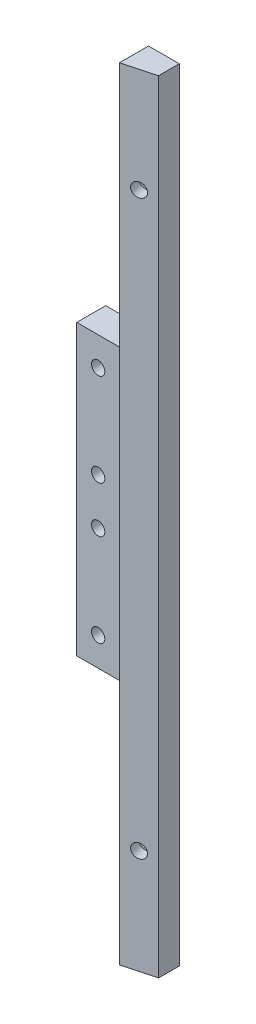
ISO-10303-21;
HEADER;
FILE_DESCRIPTION(('STEP AP214'),'2;1');
FILE_NAME('part.step','',(''),(''),'','','');
FILE_SCHEMA(('AUTOMOTIVE_DESIGN { 1 0 10303 214 1 1 1 1 }'));
ENDSEC;
DATA;
#1=APPLICATION_CONTEXT('core data for automotive mechanical design processes');
#2=APPLICATION_PROTOCOL_DEFINITION('international standard','automotive_design',2000,#1);
#3=PRODUCT_CONTEXT('',#1,'mechanical');
#4=PRODUCT('Part','Part','',(#3));
#5=PRODUCT_RELATED_PRODUCT_CATEGORY('part','',(#4));
#6=PRODUCT_DEFINITION_FORMATION('','',#4);
#7=PRODUCT_DEFINITION_CONTEXT('part definition',#1,'design');
#8=PRODUCT_DEFINITION('design','',#6,#7);
#9=PRODUCT_DEFINITION_SHAPE('','',#8);
#10=(LENGTH_UNIT() NAMED_UNIT(*) SI_UNIT(.MILLI.,.METRE.));
#11=(NAMED_UNIT(*) PLANE_ANGLE_UNIT() SI_UNIT($,.RADIAN.));
#12=(NAMED_UNIT(*) SI_UNIT($,.STERADIAN.) SOLID_ANGLE_UNIT());
#13=UNCERTAINTY_MEASURE_WITH_UNIT(LENGTH_MEASURE(1.E-05),#10,'distance_accuracy_value','');
#14=(GEOMETRIC_REPRESENTATION_CONTEXT(3) GLOBAL_UNCERTAINTY_ASSIGNED_CONTEXT((#13)) GLOBAL_UNIT_ASSIGNED_CONTEXT((#10,
#11,#12)) REPRESENTATION_CONTEXT('',''));
#15=CARTESIAN_POINT('',(0.,0.,0.));
#16=DIRECTION('',(0.,0.,1.));
#17=DIRECTION('',(1.,0.,0.));
#18=AXIS2_PLACEMENT_3D('',#15,#16,#17);
#19=CARTESIAN_POINT('',(-106.280981945714,-359.761258467887,110.891426791378));
#20=DIRECTION('',(0.,0.,-1.));
#21=DIRECTION('',(-1.,0.,0.));
#22=AXIS2_PLACEMENT_3D('',#19,#20,#21);
#23=CYLINDRICAL_SURFACE('',#22,2.30000000000001);
#24=CARTESIAN_POINT('',(-106.280981945714,-359.761258467887,0.));
#25=DIRECTION('',(0.,0.,1.));
#26=DIRECTION('',(1.,0.,0.));
#27=AXIS2_PLACEMENT_3D('',#24,#25,#26);
#28=CIRCLE('',#27,2.30000000000001);
#29=CARTESIAN_POINT('',(-103.980981945714,-359.761258467887,0.));
#30=VERTEX_POINT('',#29);
#31=EDGE_CURVE('E191',#30,#30,#28,.T.);
#32=ORIENTED_EDGE('',*,*,#31,.F.);
#33=EDGE_LOOP('',(#32));
#34=FACE_BOUND('',#33,.T.);
#35=CARTESIAN_POINT('',(-106.280981945714,-359.761258467887,10.0000000000001));
#36=DIRECTION('',(0.,0.,1.));
#37=DIRECTION('',(0.,-1.,0.));
#38=AXIS2_PLACEMENT_3D('',#35,#36,#37);
#39=CIRCLE('',#38,2.30000000000001);
#40=CARTESIAN_POINT('',(-106.280981945714,-362.061258467887,10.0000000000001));
#41=VERTEX_POINT('',#40);
#42=EDGE_CURVE('E163',#41,#41,#39,.T.);
#43=ORIENTED_EDGE('',*,*,#42,.T.);
#44=EDGE_LOOP('',(#43));
#45=FACE_BOUND('',#44,.T.);
#46=ADVANCED_FACE('F39',(#34,#45),#23,.F.);
#47=CARTESIAN_POINT('',(-113.680981945714,-401.661258467887,110.891426791378));
#48=DIRECTION('',(0.,1.,0.));
#49=DIRECTION('',(0.,0.,1.));
#50=AXIS2_PLACEMENT_3D('',#47,#48,#49);
#51=PLANE('',#50);
#52=DIRECTION('',(1.,0.,0.));
#53=VECTOR('',#52,1.);
#54=CARTESIAN_POINT('',(-113.680981945714,-401.661258467887,10.0000000000002));
#55=LINE('',#54,#53);
#56=CARTESIAN_POINT('',(-113.680981945714,-401.661258467887,10.0000000000002));
#57=VERTEX_POINT('',#56);
#58=CARTESIAN_POINT('',(-98.880981945714,-401.661258467887,10.0000000000001));
#59=VERTEX_POINT('',#58);
#60=EDGE_CURVE('E63',#57,#59,#55,.T.);
#61=ORIENTED_EDGE('',*,*,#60,.F.);
#62=DIRECTION('',(0.,0.,-1.));
#63=VECTOR('',#62,1.);
#64=CARTESIAN_POINT('',(-113.680981945714,-401.661258467887,110.891426791378));
#65=LINE('',#64,#63);
#66=CARTESIAN_POINT('',(-113.680981945714,-401.661258467887,0.));
#67=VERTEX_POINT('',#66);
#68=EDGE_CURVE('E49',#57,#67,#65,.T.);
#69=ORIENTED_EDGE('',*,*,#68,.T.);
#70=DIRECTION('',(1.,0.,0.));
#71=VECTOR('',#70,1.);
#72=CARTESIAN_POINT('',(-113.680981945714,-401.661258467887,0.));
#73=LINE('',#72,#71);
#74=CARTESIAN_POINT('',(-98.880981945714,-401.661258467887,0.));
#75=VERTEX_POINT('',#74);
#76=EDGE_CURVE('E205',#67,#75,#73,.T.);
#77=ORIENTED_EDGE('',*,*,#76,.T.);
#78=DIRECTION('',(0.,0.,-1.));
#79=VECTOR('',#78,1.);
#80=CARTESIAN_POINT('',(-98.880981945714,-401.661258467887,110.891426791378));
#81=LINE('',#80,#79);
#82=EDGE_CURVE('E212',#59,#75,#81,.T.);
#83=ORIENTED_EDGE('',*,*,#82,.F.);
#84=EDGE_LOOP('',(#61,#69,#77,#83));
#85=FACE_BOUND('',#84,.T.);
#86=ADVANCED_FACE('F216',(#85),#51,.F.);
#87=CARTESIAN_POINT('',(-113.680981945714,-301.861258467887,110.891426791378));
#88=DIRECTION('',(1.,0.,0.));
#89=DIRECTION('',(0.,0.,-1.));
#90=AXIS2_PLACEMENT_3D('',#87,#88,#89);
#91=PLANE('',#90);
#92=DIRECTION('',(0.,-1.,0.));
#93=VECTOR('',#92,1.);
#94=CARTESIAN_POINT('',(-113.680981945714,-301.861258467887,10.0000000000001));
#95=LINE('',#94,#93);
#96=CARTESIAN_POINT('',(-113.680981945714,-301.861258467887,10.0000000000001));
#97=VERTEX_POINT('',#96);
#98=EDGE_CURVE('E55',#97,#57,#95,.T.);
#99=ORIENTED_EDGE('',*,*,#98,.F.);
#100=DIRECTION('',(0.,0.,-1.));
#101=VECTOR('',#100,1.);
#102=CARTESIAN_POINT('',(-113.680981945714,-301.861258467887,110.891426791378));
#103=LINE('',#102,#101);
#104=CARTESIAN_POINT('',(-113.680981945714,-301.861258467887,0.));
#105=VERTEX_POINT('',#104);
#106=EDGE_CURVE('E11',#97,#105,#103,.T.);
#107=ORIENTED_EDGE('',*,*,#106,.T.);
#108=DIRECTION('',(0.,-1.,0.));
#109=VECTOR('',#108,1.);
#110=CARTESIAN_POINT('',(-113.680981945714,-301.861258467887,0.));
#111=LINE('',#110,#109);
#112=EDGE_CURVE('E201',#105,#67,#111,.T.);
#113=ORIENTED_EDGE('',*,*,#112,.T.);
#114=ORIENTED_EDGE('',*,*,#68,.F.);
#115=EDGE_LOOP('',(#99,#107,#113,#114));
#116=FACE_BOUND('',#115,.T.);
#117=ADVANCED_FACE('F218',(#116),#91,.F.);
#118=CARTESIAN_POINT('',(-113.680981945714,-301.861258467887,110.891426791378));
#119=DIRECTION('',(0.,-1.,0.));
#120=DIRECTION('',(0.,0.,-1.));
#121=AXIS2_PLACEMENT_3D('',#118,#119,#120);
#122=PLANE('',#121);
#123=DIRECTION('',(-1.,0.,0.));
#124=VECTOR('',#123,1.);
#125=CARTESIAN_POINT('',(-113.680981945714,-301.861258467887,10.0000000000001));
#126=LINE('',#125,#124);
#127=CARTESIAN_POINT('',(-98.880981945714,-301.861258467887,10.0000000000001));
#128=VERTEX_POINT('',#127);
#129=EDGE_CURVE('E179',#128,#97,#126,.T.);
#130=ORIENTED_EDGE('',*,*,#129,.F.);
#131=DIRECTION('',(0.,0.,-1.));
#132=VECTOR('',#131,1.);
#133=CARTESIAN_POINT('',(-98.880981945714,-301.861258467887,110.891426791378));
#134=LINE('',#133,#132);
#135=CARTESIAN_POINT('',(-98.880981945714,-301.861258467887,0.));
#136=VERTEX_POINT('',#135);
#137=EDGE_CURVE('E209',#128,#136,#134,.T.);
#138=ORIENTED_EDGE('',*,*,#137,.T.);
#139=DIRECTION('',(-1.,0.,0.));
#140=VECTOR('',#139,1.);
#141=CARTESIAN_POINT('',(-113.680981945714,-301.861258467887,0.));
#142=LINE('',#141,#140);
#143=EDGE_CURVE('E114',#136,#105,#142,.T.);
#144=ORIENTED_EDGE('',*,*,#143,.T.);
#145=ORIENTED_EDGE('',*,*,#106,.F.);
#146=EDGE_LOOP('',(#130,#138,#144,#145));
#147=FACE_BOUND('',#146,.T.);
#148=ADVANCED_FACE('F41',(#147),#122,.F.);
#149=CARTESIAN_POINT('',(-106.280981945714,-391.761258467887,110.891426791378));
#150=DIRECTION('',(0.,0.,-1.));
#151=DIRECTION('',(-1.,0.,0.));
#152=AXIS2_PLACEMENT_3D('',#149,#150,#151);
#153=CYLINDRICAL_SURFACE('',#152,2.30000000000001);
#154=CARTESIAN_POINT('',(-106.280981945714,-391.761258467887,0.));
#155=DIRECTION('',(0.,0.,1.));
#156=DIRECTION('',(1.,0.,0.));
#157=AXIS2_PLACEMENT_3D('',#154,#155,#156);
#158=CIRCLE('',#157,2.30000000000001);
#159=CARTESIAN_POINT('',(-103.980981945714,-391.761258467887,0.));
#160=VERTEX_POINT('',#159);
#161=EDGE_CURVE('E195',#160,#160,#158,.T.);
#162=ORIENTED_EDGE('',*,*,#161,.F.);
#163=EDGE_LOOP('',(#162));
#164=FACE_BOUND('',#163,.T.);
#165=CARTESIAN_POINT('',(-106.280981945714,-391.761258467887,10.0000000000002));
#166=DIRECTION('',(0.,0.,1.));
#167=DIRECTION('',(0.,-1.,0.));
#168=AXIS2_PLACEMENT_3D('',#165,#166,#167);
#169=CIRCLE('',#168,2.30000000000001);
#170=CARTESIAN_POINT('',(-106.280981945714,-394.061258467887,10.0000000000002));
#171=VERTEX_POINT('',#170);
#172=EDGE_CURVE('E167',#171,#171,#169,.T.);
#173=ORIENTED_EDGE('',*,*,#172,.T.);
#174=EDGE_LOOP('',(#173));
#175=FACE_BOUND('',#174,.T.);
#176=ADVANCED_FACE('F300',(#164,#175),#153,.F.);
#177=CARTESIAN_POINT('',(-106.280981945714,-343.761258467887,110.891426791378));
#178=DIRECTION('',(0.,0.,-1.));
#179=DIRECTION('',(-1.,0.,0.));
#180=AXIS2_PLACEMENT_3D('',#177,#178,#179);
#181=CYLINDRICAL_SURFACE('',#180,2.30000000000001);
#182=CARTESIAN_POINT('',(-106.280981945714,-343.761258467887,0.));
#183=DIRECTION('',(0.,0.,1.));
#184=DIRECTION('',(1.,0.,0.));
#185=AXIS2_PLACEMENT_3D('',#182,#183,#184);
#186=CIRCLE('',#185,2.30000000000001);
#187=CARTESIAN_POINT('',(-103.980981945714,-343.761258467887,0.));
#188=VERTEX_POINT('',#187);
#189=EDGE_CURVE('E187',#188,#188,#186,.T.);
#190=ORIENTED_EDGE('',*,*,#189,.F.);
#191=EDGE_LOOP('',(#190));
#192=FACE_BOUND('',#191,.T.);
#193=CARTESIAN_POINT('',(-106.280981945714,-343.761258467887,10.0000000000001));
#194=DIRECTION('',(0.,0.,1.));
#195=DIRECTION('',(0.,-1.,0.));
#196=AXIS2_PLACEMENT_3D('',#193,#194,#195);
#197=CIRCLE('',#196,2.30000000000001);
#198=CARTESIAN_POINT('',(-106.280981945714,-346.061258467887,10.0000000000001));
#199=VERTEX_POINT('',#198);
#200=EDGE_CURVE('E159',#199,#199,#197,.T.);
#201=ORIENTED_EDGE('',*,*,#200,.T.);
#202=EDGE_LOOP('',(#201));
#203=FACE_BOUND('',#202,.T.);
#204=ADVANCED_FACE('F298',(#192,#203),#181,.F.);
#205=CARTESIAN_POINT('',(0.,0.,0.));
#206=DIRECTION('',(0.,0.,-1.));
#207=DIRECTION('',(-1.,0.,0.));
#208=AXIS2_PLACEMENT_3D('',#205,#206,#207);
#209=PLANE('',#208);
#210=ORIENTED_EDGE('',*,*,#189,.T.);
#211=EDGE_LOOP('',(#210));
#212=FACE_BOUND('',#211,.T.);
#213=ORIENTED_EDGE('',*,*,#161,.T.);
#214=EDGE_LOOP('',(#213));
#215=FACE_BOUND('',#214,.T.);
#216=ORIENTED_EDGE('',*,*,#143,.F.);
#217=DIRECTION('',(0.,-1.,0.));
#218=VECTOR('',#217,1.);
#219=CARTESIAN_POINT('',(-98.880981945714,-216.761258467887,0.));
#220=LINE('',#219,#218);
#221=CARTESIAN_POINT('',(-98.880981945714,-216.761258467887,0.));
#222=VERTEX_POINT('',#221);
#223=EDGE_CURVE('E105',#222,#136,#220,.T.);
#224=ORIENTED_EDGE('',*,*,#223,.F.);
#225=DIRECTION('',(-1.,0.,0.));
#226=VECTOR('',#225,1.);
#227=CARTESIAN_POINT('',(-98.880981945714,-216.761258467887,0.));
#228=LINE('',#227,#226);
#229=CARTESIAN_POINT('',(-88.2557978565342,-216.761258467887,0.));
#230=VERTEX_POINT('',#229);
#231=EDGE_CURVE('E110',#230,#222,#228,.T.);
#232=ORIENTED_EDGE('',*,*,#231,.F.);
#233=DIRECTION('',(0.,1.,0.));
#234=VECTOR('',#233,1.);
#235=CARTESIAN_POINT('',(-88.2557978565342,-216.761258467887,0.));
#236=LINE('',#235,#234);
#237=CARTESIAN_POINT('',(-88.2557978565342,-486.761258467887,0.));
#238=VERTEX_POINT('',#237);
#239=EDGE_CURVE('E144',#238,#230,#236,.T.);
#240=ORIENTED_EDGE('',*,*,#239,.F.);
#241=DIRECTION('',(1.,0.,0.));
#242=VECTOR('',#241,1.);
#243=CARTESIAN_POINT('',(-98.880981945714,-486.761258467887,0.));
#244=LINE('',#243,#242);
#245=CARTESIAN_POINT('',(-98.880981945714,-486.761258467887,0.));
#246=VERTEX_POINT('',#245);
#247=EDGE_CURVE('E148',#246,#238,#244,.T.);
#248=ORIENTED_EDGE('',*,*,#247,.F.);
#249=EDGE_CURVE('E119',#75,#246,#220,.T.);
#250=ORIENTED_EDGE('',*,*,#249,.F.);
#251=ORIENTED_EDGE('',*,*,#76,.F.);
#252=ORIENTED_EDGE('',*,*,#112,.F.);
#253=EDGE_LOOP('',(#216,#224,#232,#240,#248,#250,#251,#252));
#254=FACE_BOUND('',#253,.T.);
#255=ORIENTED_EDGE('',*,*,#31,.T.);
#256=EDGE_LOOP('',(#255));
#257=FACE_BOUND('',#256,.T.);
#258=CARTESIAN_POINT('',(-106.280981945714,-311.761258467887,0.));
#259=DIRECTION('',(0.,0.,1.));
#260=DIRECTION('',(1.,0.,0.));
#261=AXIS2_PLACEMENT_3D('',#258,#259,#260);
#262=CIRCLE('',#261,2.30000000000001);
#263=CARTESIAN_POINT('',(-103.980981945714,-311.761258467887,0.));
#264=VERTEX_POINT('',#263);
#265=EDGE_CURVE('E183',#264,#264,#262,.T.);
#266=ORIENTED_EDGE('',*,*,#265,.T.);
#267=EDGE_LOOP('',(#266));
#268=FACE_BOUND('',#267,.T.);
#269=ADVANCED_FACE('F107',(#212,#215,#254,#257,#268),#209,.T.);
#270=CARTESIAN_POINT('',(-106.280981945714,-311.761258467887,110.891426791378));
#271=DIRECTION('',(0.,0.,-1.));
#272=DIRECTION('',(-1.,0.,0.));
#273=AXIS2_PLACEMENT_3D('',#270,#271,#272);
#274=CYLINDRICAL_SURFACE('',#273,2.30000000000001);
#275=ORIENTED_EDGE('',*,*,#265,.F.);
#276=EDGE_LOOP('',(#275));
#277=FACE_BOUND('',#276,.T.);
#278=CARTESIAN_POINT('',(-106.280981945714,-311.761258467887,10.0000000000001));
#279=DIRECTION('',(0.,0.,1.));
#280=DIRECTION('',(0.,-1.,0.));
#281=AXIS2_PLACEMENT_3D('',#278,#279,#280);
#282=CIRCLE('',#281,2.30000000000001);
#283=CARTESIAN_POINT('',(-106.280981945714,-314.061258467887,10.0000000000001));
#284=VERTEX_POINT('',#283);
#285=EDGE_CURVE('E43',#284,#284,#282,.T.);
#286=ORIENTED_EDGE('',*,*,#285,.T.);
#287=EDGE_LOOP('',(#286));
#288=FACE_BOUND('',#287,.T.);
#289=ADVANCED_FACE('F228',(#277,#288),#274,.F.);
#290=CARTESIAN_POINT('',(-153.780981945714,-206.761258467887,10.));
#291=DIRECTION('',(0.,0.,1.));
#292=DIRECTION('',(0.,1.,0.));
#293=AXIS2_PLACEMENT_3D('',#290,#291,#292);
#294=PLANE('',#293);
#295=ORIENTED_EDGE('',*,*,#285,.F.);
#296=EDGE_LOOP('',(#295));
#297=FACE_BOUND('',#296,.T.);
#298=ORIENTED_EDGE('',*,*,#200,.F.);
#299=EDGE_LOOP('',(#298));
#300=FACE_BOUND('',#299,.T.);
#301=ORIENTED_EDGE('',*,*,#42,.F.);
#302=EDGE_LOOP('',(#301));
#303=FACE_BOUND('',#302,.T.);
#304=ORIENTED_EDGE('',*,*,#172,.F.);
#305=EDGE_LOOP('',(#304));
#306=FACE_BOUND('',#305,.T.);
#307=DIRECTION('',(0.,1.,0.));
#308=VECTOR('',#307,1.);
#309=CARTESIAN_POINT('',(-98.880981945714,-301.861258467887,10.0000000000001));
#310=LINE('',#309,#308);
#311=EDGE_CURVE('E171',#59,#128,#310,.T.);
#312=ORIENTED_EDGE('',*,*,#311,.T.);
#313=ORIENTED_EDGE('',*,*,#129,.T.);
#314=ORIENTED_EDGE('',*,*,#98,.T.);
#315=ORIENTED_EDGE('',*,*,#60,.T.);
#316=EDGE_LOOP('',(#312,#313,#314,#315));
#317=FACE_BOUND('',#316,.T.);
#318=ADVANCED_FACE('F230',(#297,#300,#303,#306,#317),#294,.T.);
#319=CARTESIAN_POINT('',(-98.880981945714,-216.761258467887,-268.800476423112));
#320=DIRECTION('',(-1.,0.,0.));
#321=DIRECTION('',(0.,-1.,0.));
#322=AXIS2_PLACEMENT_3D('',#319,#320,#321);
#323=PLANE('',#322);
#324=ORIENTED_EDGE('',*,*,#137,.F.);
#325=DIRECTION('',(0.,-1.,0.));
#326=VECTOR('',#325,1.);
#327=CARTESIAN_POINT('',(-98.880981945714,-216.761258467887,10.0000000000001));
#328=LINE('',#327,#326);
#329=CARTESIAN_POINT('',(-98.880981945714,-216.761258467887,10.0000000000001));
#330=VERTEX_POINT('',#329);
#331=EDGE_CURVE('E125',#330,#128,#328,.T.);
#332=ORIENTED_EDGE('',*,*,#331,.F.);
#333=DIRECTION('',(0.,0.,1.));
#334=VECTOR('',#333,1.);
#335=CARTESIAN_POINT('',(-98.880981945714,-216.761258467887,-268.800476423112));
#336=LINE('',#335,#334);
#337=EDGE_CURVE('E122',#222,#330,#336,.T.);
#338=ORIENTED_EDGE('',*,*,#337,.F.);
#339=ORIENTED_EDGE('',*,*,#223,.T.);
#340=EDGE_LOOP('',(#324,#332,#338,#339));
#341=FACE_BOUND('',#340,.T.);
#342=ADVANCED_FACE('F123',(#341),#323,.T.);
#343=CARTESIAN_POINT('',(-4.12376981478747,0.,-15.3901184675059));
#344=DIRECTION('',(0.258819045102518,0.,0.965925826289069));
#345=DIRECTION('',(0.965925826289069,0.,-0.258819045102518));
#346=AXIS2_PLACEMENT_3D('',#343,#344,#345);
#347=PLANE('',#346);
#348=CARTESIAN_POINT('',(-93.5683899011242,-252.871258467887,8.57649525193628));
#349=DIRECTION('',(0.258819045102518,0.,0.965925826289069));
#350=DIRECTION('',(0.965925826289069,0.,-0.258819045102518));
#351=AXIS2_PLACEMENT_3D('',#348,#349,#350);
#352=CIRCLE('',#351,2.40000000000001);
#353=CARTESIAN_POINT('',(-91.2501679180304,-252.871258467887,7.95532954369024));
#354=VERTEX_POINT('',#353);
#355=EDGE_CURVE('E262',#354,#354,#352,.T.);
#356=ORIENTED_EDGE('',*,*,#355,.F.);
#357=EDGE_LOOP('',(#356));
#358=FACE_BOUND('',#357,.T.);
#359=CARTESIAN_POINT('',(-93.5683899011241,-450.651258467887,8.57649525193627));
#360=DIRECTION('',(0.258819045102518,0.,0.965925826289069));
#361=DIRECTION('',(0.965925826289069,0.,-0.258819045102518));
#362=AXIS2_PLACEMENT_3D('',#359,#360,#361);
#363=CIRCLE('',#362,2.40000000000001);
#364=CARTESIAN_POINT('',(-91.2501679180303,-450.651258467887,7.95532954369022));
#365=VERTEX_POINT('',#364);
#366=EDGE_CURVE('E254',#365,#365,#363,.T.);
#367=ORIENTED_EDGE('',*,*,#366,.F.);
#368=EDGE_LOOP('',(#367));
#369=FACE_BOUND('',#368,.T.);
#370=DIRECTION('',(0.,1.,0.));
#371=VECTOR('',#370,1.);
#372=CARTESIAN_POINT('',(-88.2557978565342,-216.761258467887,7.15299050387243));
#373=LINE('',#372,#371);
#374=CARTESIAN_POINT('',(-88.2557978565342,-486.761258467887,7.15299050387242));
#375=VERTEX_POINT('',#374);
#376=CARTESIAN_POINT('',(-88.2557978565342,-216.761258467887,7.15299050387243));
#377=VERTEX_POINT('',#376);
#378=EDGE_CURVE('E142',#375,#377,#373,.T.);
#379=ORIENTED_EDGE('',*,*,#378,.T.);
#380=DIRECTION('',(-0.965925826289069,0.,0.258819045102518));
#381=VECTOR('',#380,1.);
#382=CARTESIAN_POINT('',(-98.880981945714,-216.761258467887,10.0000000000001));
#383=LINE('',#382,#381);
#384=EDGE_CURVE('E249',#377,#330,#383,.T.);
#385=ORIENTED_EDGE('',*,*,#384,.T.);
#386=ORIENTED_EDGE('',*,*,#331,.T.);
#387=ORIENTED_EDGE('',*,*,#311,.F.);
#388=CARTESIAN_POINT('',(-98.880981945714,-486.761258467887,10.0000000000001));
#389=VERTEX_POINT('',#388);
#390=EDGE_CURVE('E245',#59,#389,#328,.T.);
#391=ORIENTED_EDGE('',*,*,#390,.T.);
#392=DIRECTION('',(0.965925826289069,0.,-0.258819045102518));
#393=VECTOR('',#392,1.);
#394=CARTESIAN_POINT('',(-98.880981945714,-486.761258467887,10.0000000000001));
#395=LINE('',#394,#393);
#396=EDGE_CURVE('E135',#389,#375,#395,.T.);
#397=ORIENTED_EDGE('',*,*,#396,.T.);
#398=EDGE_LOOP('',(#379,#385,#386,#387,#391,#397));
#399=FACE_BOUND('',#398,.T.);
#400=ADVANCED_FACE('F244',(#358,#369,#399),#347,.T.);
#401=CARTESIAN_POINT('',(-98.880981945714,-216.761258467887,-268.800476423112));
#402=DIRECTION('',(0.,1.,0.));
#403=DIRECTION('',(0.,0.,1.));
#404=AXIS2_PLACEMENT_3D('',#401,#402,#403);
#405=PLANE('',#404);
#406=DIRECTION('',(0.,0.,1.));
#407=VECTOR('',#406,1.);
#408=CARTESIAN_POINT('',(-88.2557978565342,-216.761258467887,-271.64748591924));
#409=LINE('',#408,#407);
#410=EDGE_CURVE('E133',#230,#377,#409,.T.);
#411=ORIENTED_EDGE('',*,*,#410,.F.);
#412=ORIENTED_EDGE('',*,*,#231,.T.);
#413=ORIENTED_EDGE('',*,*,#337,.T.);
#414=ORIENTED_EDGE('',*,*,#384,.F.);
#415=EDGE_LOOP('',(#411,#412,#413,#414));
#416=FACE_BOUND('',#415,.T.);
#417=ADVANCED_FACE('F132',(#416),#405,.T.);
#418=ORIENTED_EDGE('',*,*,#390,.F.);
#419=ORIENTED_EDGE('',*,*,#82,.T.);
#420=ORIENTED_EDGE('',*,*,#249,.T.);
#421=DIRECTION('',(0.,0.,1.));
#422=VECTOR('',#421,1.);
#423=CARTESIAN_POINT('',(-98.880981945714,-486.761258467887,-268.800476423112));
#424=LINE('',#423,#422);
#425=EDGE_CURVE('E118',#246,#389,#424,.T.);
#426=ORIENTED_EDGE('',*,*,#425,.T.);
#427=EDGE_LOOP('',(#418,#419,#420,#426));
#428=FACE_BOUND('',#427,.T.);
#429=ADVANCED_FACE('F246',(#428),#323,.T.);
#430=CARTESIAN_POINT('',(-98.880981945714,-486.761258467887,-268.800476423112));
#431=DIRECTION('',(0.,-1.,0.));
#432=DIRECTION('',(0.,0.,-1.));
#433=AXIS2_PLACEMENT_3D('',#430,#431,#432);
#434=PLANE('',#433);
#435=ORIENTED_EDGE('',*,*,#425,.F.);
#436=ORIENTED_EDGE('',*,*,#247,.T.);
#437=DIRECTION('',(0.,0.,1.));
#438=VECTOR('',#437,1.);
#439=CARTESIAN_POINT('',(-88.2557978565342,-486.761258467887,-271.64748591924));
#440=LINE('',#439,#438);
#441=EDGE_CURVE('E147',#238,#375,#440,.T.);
#442=ORIENTED_EDGE('',*,*,#441,.T.);
#443=ORIENTED_EDGE('',*,*,#396,.F.);
#444=EDGE_LOOP('',(#435,#436,#442,#443));
#445=FACE_BOUND('',#444,.T.);
#446=ADVANCED_FACE('F277',(#445),#434,.T.);
#447=CARTESIAN_POINT('',(-88.2557978565342,-216.761258467887,-271.64748591924));
#448=DIRECTION('',(1.,0.,0.));
#449=DIRECTION('',(0.,1.,0.));
#450=AXIS2_PLACEMENT_3D('',#447,#448,#449);
#451=PLANE('',#450);
#452=ORIENTED_EDGE('',*,*,#441,.F.);
#453=ORIENTED_EDGE('',*,*,#239,.T.);
#454=ORIENTED_EDGE('',*,*,#410,.T.);
#455=ORIENTED_EDGE('',*,*,#378,.F.);
#456=EDGE_LOOP('',(#452,#453,#454,#455));
#457=FACE_BOUND('',#456,.T.);
#458=ADVANCED_FACE('F275',(#457),#451,.T.);
#459=CARTESIAN_POINT('',(-94.6036660815342,-450.651258467887,4.71279194677999));
#460=DIRECTION('',(0.258819045102518,0.,0.965925826289069));
#461=DIRECTION('',(0.965925826289069,0.,-0.258819045102518));
#462=AXIS2_PLACEMENT_3D('',#459,#460,#461);
#463=CYLINDRICAL_SURFACE('',#462,2.40000000000001);
#464=CARTESIAN_POINT('',(-94.6036660815342,-450.651258467887,4.71279194677999));
#465=DIRECTION('',(0.258819045102518,0.,0.965925826289069));
#466=DIRECTION('',(0.965925826289069,0.,-0.258819045102518));
#467=AXIS2_PLACEMENT_3D('',#464,#465,#466);
#468=CIRCLE('',#467,2.40000000000001);
#469=CARTESIAN_POINT('',(-92.2854440984404,-450.651258467887,4.09162623853395));
#470=VERTEX_POINT('',#469);
#471=EDGE_CURVE('E258',#470,#470,#468,.T.);
#472=ORIENTED_EDGE('',*,*,#471,.F.);
#473=EDGE_LOOP('',(#472));
#474=FACE_BOUND('',#473,.T.);
#475=ORIENTED_EDGE('',*,*,#366,.T.);
#476=EDGE_LOOP('',(#475));
#477=FACE_BOUND('',#476,.T.);
#478=ADVANCED_FACE('F284',(#474,#477),#463,.F.);
#479=CARTESIAN_POINT('',(-94.6036660815342,-450.651258467887,4.71279194677999));
#480=DIRECTION('',(0.258819045102518,0.,0.965925826289069));
#481=DIRECTION('',(0.965925826289069,0.,-0.258819045102518));
#482=AXIS2_PLACEMENT_3D('',#479,#480,#481);
#483=PLANE('',#482);
#484=ORIENTED_EDGE('',*,*,#471,.T.);
#485=EDGE_LOOP('',(#484));
#486=FACE_BOUND('',#485,.T.);
#487=ADVANCED_FACE('F379',(#486),#483,.T.);
#488=CARTESIAN_POINT('',(-94.6036660815343,-252.871258467887,4.71279194678001));
#489=DIRECTION('',(0.258819045102518,0.,0.965925826289069));
#490=DIRECTION('',(0.965925826289069,0.,-0.258819045102518));
#491=AXIS2_PLACEMENT_3D('',#488,#489,#490);
#492=CYLINDRICAL_SURFACE('',#491,2.40000000000001);
#493=CARTESIAN_POINT('',(-94.6036660815343,-252.871258467887,4.71279194678001));
#494=DIRECTION('',(0.258819045102518,0.,0.965925826289069));
#495=DIRECTION('',(0.965925826289069,0.,-0.258819045102518));
#496=AXIS2_PLACEMENT_3D('',#493,#494,#495);
#497=CIRCLE('',#496,2.40000000000001);
#498=CARTESIAN_POINT('',(-92.2854440984405,-252.871258467887,4.09162623853396));
#499=VERTEX_POINT('',#498);
#500=EDGE_CURVE('E266',#499,#499,#497,.T.);
#501=ORIENTED_EDGE('',*,*,#500,.F.);
#502=EDGE_LOOP('',(#501));
#503=FACE_BOUND('',#502,.T.);
#504=ORIENTED_EDGE('',*,*,#355,.T.);
#505=EDGE_LOOP('',(#504));
#506=FACE_BOUND('',#505,.T.);
#507=ADVANCED_FACE('F386',(#503,#506),#492,.F.);
#508=CARTESIAN_POINT('',(-94.6036660815343,-252.871258467887,4.71279194678001));
#509=DIRECTION('',(0.258819045102518,0.,0.965925826289069));
#510=DIRECTION('',(0.965925826289069,0.,-0.258819045102518));
#511=AXIS2_PLACEMENT_3D('',#508,#509,#510);
#512=PLANE('',#511);
#513=ORIENTED_EDGE('',*,*,#500,.T.);
#514=EDGE_LOOP('',(#513));
#515=FACE_BOUND('',#514,.T.);
#516=ADVANCED_FACE('F394',(#515),#512,.T.);
#517=CLOSED_SHELL('',(#46,#86,#117,#148,#176,#204,#269,#289,#318,#342,#400,#417,#429,#446,#458,
#478,#487,#507,#516));
#518=MANIFOLD_SOLID_BREP('B2',#517);
#519=ADVANCED_BREP_SHAPE_REPRESENTATION('',(#18,#518),#14);
#520=SHAPE_DEFINITION_REPRESENTATION(#9,#519);
ENDSEC;
END-ISO-10303-21;
